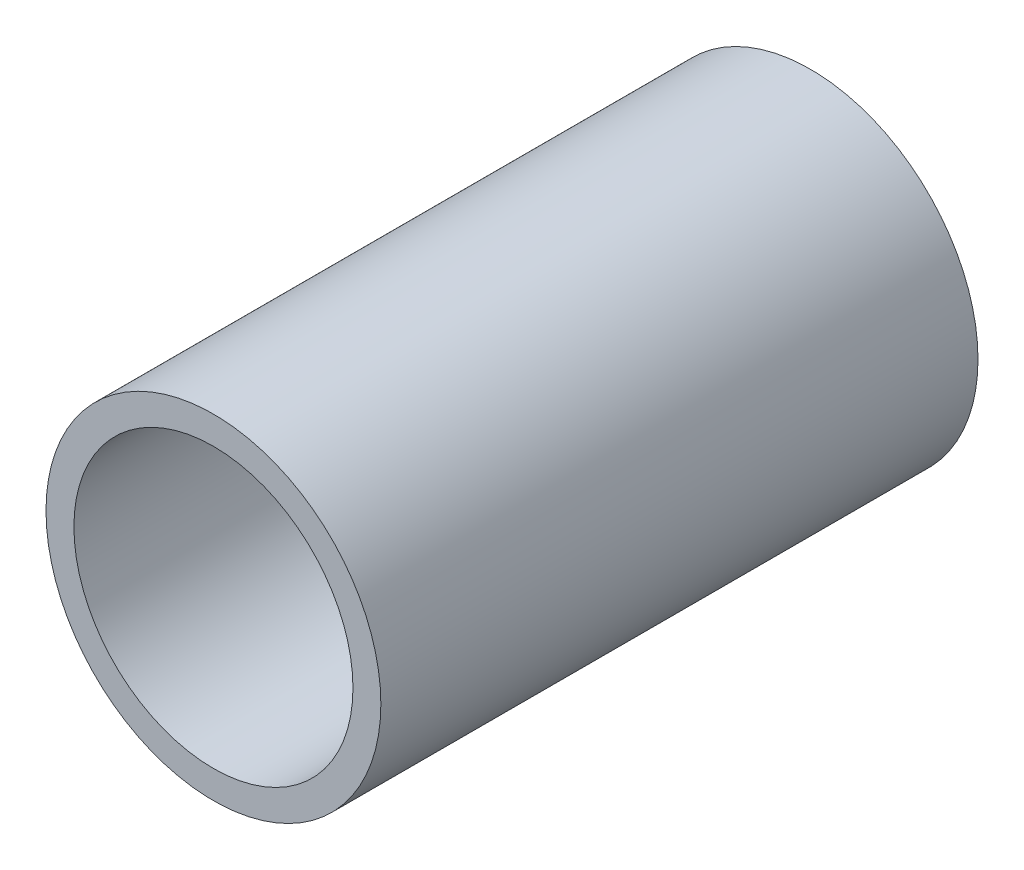
ISO-10303-21;
HEADER;
FILE_DESCRIPTION(('STEP AP214'),'2;1');
FILE_NAME('part.step','',(''),(''),'','','');
FILE_SCHEMA(('AUTOMOTIVE_DESIGN { 1 0 10303 214 1 1 1 1 }'));
ENDSEC;
DATA;
#1=APPLICATION_CONTEXT('core data for automotive mechanical design processes');
#2=APPLICATION_PROTOCOL_DEFINITION('international standard','automotive_design',2000,#1);
#3=PRODUCT_CONTEXT('',#1,'mechanical');
#4=PRODUCT('Part','Part','',(#3));
#5=PRODUCT_RELATED_PRODUCT_CATEGORY('part','',(#4));
#6=PRODUCT_DEFINITION_FORMATION('','',#4);
#7=PRODUCT_DEFINITION_CONTEXT('part definition',#1,'design');
#8=PRODUCT_DEFINITION('design','',#6,#7);
#9=PRODUCT_DEFINITION_SHAPE('','',#8);
#10=(LENGTH_UNIT() NAMED_UNIT(*) SI_UNIT(.MILLI.,.METRE.));
#11=(NAMED_UNIT(*) PLANE_ANGLE_UNIT() SI_UNIT($,.RADIAN.));
#12=(NAMED_UNIT(*) SI_UNIT($,.STERADIAN.) SOLID_ANGLE_UNIT());
#13=UNCERTAINTY_MEASURE_WITH_UNIT(LENGTH_MEASURE(1.E-05),#10,'distance_accuracy_value','');
#14=(GEOMETRIC_REPRESENTATION_CONTEXT(3) GLOBAL_UNCERTAINTY_ASSIGNED_CONTEXT((#13)) GLOBAL_UNIT_ASSIGNED_CONTEXT((#10,
#11,#12)) REPRESENTATION_CONTEXT('',''));
#15=CARTESIAN_POINT('',(0.,0.,0.));
#16=DIRECTION('',(0.,0.,1.));
#17=DIRECTION('',(1.,0.,0.));
#18=AXIS2_PLACEMENT_3D('',#15,#16,#17);
#19=CARTESIAN_POINT('',(0.,0.,-38.3693627484771));
#20=DIRECTION('',(0.,0.,1.));
#21=DIRECTION('',(1.,0.,0.));
#22=AXIS2_PLACEMENT_3D('',#19,#20,#21);
#23=CYLINDRICAL_SURFACE('',#22,6.);
#24=CARTESIAN_POINT('',(0.,0.,-21.3988));
#25=DIRECTION('',(0.,0.,1.));
#26=DIRECTION('',(1.,0.,0.));
#27=AXIS2_PLACEMENT_3D('',#24,#25,#26);
#28=CIRCLE('',#27,6.);
#29=CARTESIAN_POINT('',(6.,0.,-21.3988));
#30=VERTEX_POINT('',#29);
#31=EDGE_CURVE('E10',#30,#30,#28,.F.);
#32=ORIENTED_EDGE('',*,*,#31,.F.);
#33=EDGE_LOOP('',(#32));
#34=FACE_BOUND('',#33,.T.);
#35=CARTESIAN_POINT('',(0.,0.,0.));
#36=DIRECTION('',(0.,0.,1.));
#37=DIRECTION('',(1.,0.,0.));
#38=AXIS2_PLACEMENT_3D('',#35,#36,#37);
#39=CIRCLE('',#38,6.);
#40=CARTESIAN_POINT('',(6.,0.,0.));
#41=VERTEX_POINT('',#40);
#42=EDGE_CURVE('E46',#41,#41,#39,.T.);
#43=ORIENTED_EDGE('',*,*,#42,.F.);
#44=EDGE_LOOP('',(#43));
#45=FACE_BOUND('',#44,.T.);
#46=ADVANCED_FACE('F35',(#34,#45),#23,.T.);
#47=CARTESIAN_POINT('',(0.,0.,0.));
#48=DIRECTION('',(0.,0.,1.));
#49=DIRECTION('',(1.,0.,0.));
#50=AXIS2_PLACEMENT_3D('',#47,#48,#49);
#51=PLANE('',#50);
#52=CARTESIAN_POINT('',(0.,0.,0.));
#53=DIRECTION('',(0.,0.,1.));
#54=DIRECTION('',(1.,0.,0.));
#55=AXIS2_PLACEMENT_3D('',#52,#53,#54);
#56=CIRCLE('',#55,5.);
#57=CARTESIAN_POINT('',(5.,0.,0.));
#58=VERTEX_POINT('',#57);
#59=EDGE_CURVE('E48',#58,#58,#56,.T.);
#60=ORIENTED_EDGE('',*,*,#59,.F.);
#61=EDGE_LOOP('',(#60));
#62=FACE_BOUND('',#61,.T.);
#63=ORIENTED_EDGE('',*,*,#42,.T.);
#64=EDGE_LOOP('',(#63));
#65=FACE_BOUND('',#64,.T.);
#66=ADVANCED_FACE('F53',(#62,#65),#51,.T.);
#67=CARTESIAN_POINT('',(0.,0.,-38.3693627484771));
#68=DIRECTION('',(0.,0.,1.));
#69=DIRECTION('',(1.,0.,0.));
#70=AXIS2_PLACEMENT_3D('',#67,#68,#69);
#71=CYLINDRICAL_SURFACE('',#70,5.);
#72=CARTESIAN_POINT('',(0.,0.,-21.3988));
#73=DIRECTION('',(0.,0.,1.));
#74=DIRECTION('',(1.,0.,0.));
#75=AXIS2_PLACEMENT_3D('',#72,#73,#74);
#76=CIRCLE('',#75,5.);
#77=CARTESIAN_POINT('',(5.,0.,-21.3988));
#78=VERTEX_POINT('',#77);
#79=EDGE_CURVE('E38',#78,#78,#76,.F.);
#80=ORIENTED_EDGE('',*,*,#79,.T.);
#81=EDGE_LOOP('',(#80));
#82=FACE_BOUND('',#81,.T.);
#83=ORIENTED_EDGE('',*,*,#59,.T.);
#84=EDGE_LOOP('',(#83));
#85=FACE_BOUND('',#84,.T.);
#86=ADVANCED_FACE('F60',(#82,#85),#71,.F.);
#87=CARTESIAN_POINT('',(45.1079004534855,-61.1373643255779,-21.3988));
#88=DIRECTION('',(0.,0.,1.));
#89=DIRECTION('',(0.499953033775789,-0.866052518048637,0.));
#90=AXIS2_PLACEMENT_3D('',#87,#88,#89);
#91=PLANE('',#90);
#92=ORIENTED_EDGE('',*,*,#31,.T.);
#93=EDGE_LOOP('',(#92));
#94=FACE_BOUND('',#93,.T.);
#95=ORIENTED_EDGE('',*,*,#79,.F.);
#96=EDGE_LOOP('',(#95));
#97=FACE_BOUND('',#96,.T.);
#98=ADVANCED_FACE('F65',(#94,#97),#91,.F.);
#99=CLOSED_SHELL('',(#46,#66,#86,#98));
#100=MANIFOLD_SOLID_BREP('B2',#99);
#101=ADVANCED_BREP_SHAPE_REPRESENTATION('',(#18,#100),#14);
#102=SHAPE_DEFINITION_REPRESENTATION(#9,#101);
ENDSEC;
END-ISO-10303-21;
